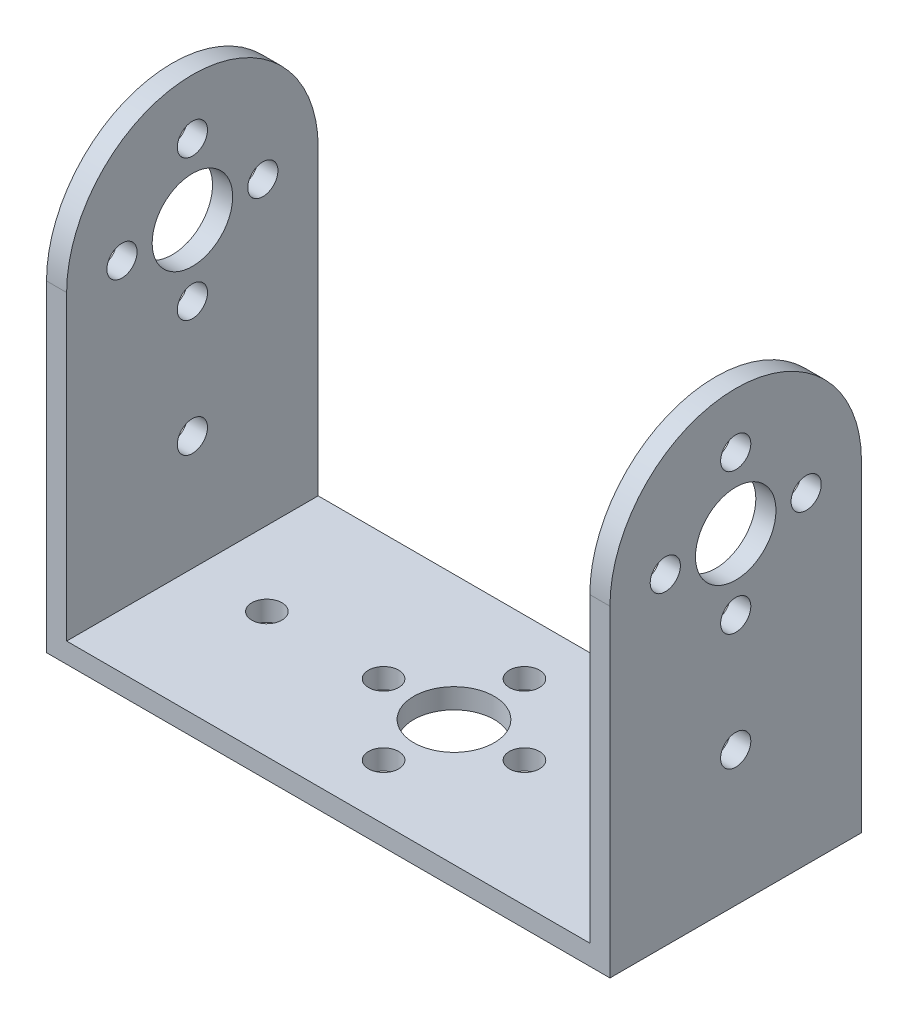
ISO-10303-21;
HEADER;
FILE_DESCRIPTION(('STEP AP214'),'2;1');
FILE_NAME('part.step','',(''),(''),'','','');
FILE_SCHEMA(('AUTOMOTIVE_DESIGN { 1 0 10303 214 1 1 1 1 }'));
ENDSEC;
DATA;
#1=APPLICATION_CONTEXT('core data for automotive mechanical design processes');
#2=APPLICATION_PROTOCOL_DEFINITION('international standard','automotive_design',2000,#1);
#3=PRODUCT_CONTEXT('',#1,'mechanical');
#4=PRODUCT('Part','Part','',(#3));
#5=PRODUCT_RELATED_PRODUCT_CATEGORY('part','',(#4));
#6=PRODUCT_DEFINITION_FORMATION('','',#4);
#7=PRODUCT_DEFINITION_CONTEXT('part definition',#1,'design');
#8=PRODUCT_DEFINITION('design','',#6,#7);
#9=PRODUCT_DEFINITION_SHAPE('','',#8);
#10=(LENGTH_UNIT() NAMED_UNIT(*) SI_UNIT(.MILLI.,.METRE.));
#11=(NAMED_UNIT(*) PLANE_ANGLE_UNIT() SI_UNIT($,.RADIAN.));
#12=(NAMED_UNIT(*) SI_UNIT($,.STERADIAN.) SOLID_ANGLE_UNIT());
#13=UNCERTAINTY_MEASURE_WITH_UNIT(LENGTH_MEASURE(1.E-05),#10,'distance_accuracy_value','');
#14=(GEOMETRIC_REPRESENTATION_CONTEXT(3) GLOBAL_UNCERTAINTY_ASSIGNED_CONTEXT((#13)) GLOBAL_UNIT_ASSIGNED_CONTEXT((#10,
#11,#12)) REPRESENTATION_CONTEXT('',''));
#15=CARTESIAN_POINT('',(0.,0.,0.));
#16=DIRECTION('',(0.,0.,1.));
#17=DIRECTION('',(1.,0.,0.));
#18=AXIS2_PLACEMENT_3D('',#15,#16,#17);
#19=CARTESIAN_POINT('',(0.,2.,0.));
#20=DIRECTION('',(0.,1.,0.));
#21=DIRECTION('',(0.,0.,1.));
#22=AXIS2_PLACEMENT_3D('',#19,#20,#21);
#23=PLANE('',#22);
#24=CARTESIAN_POINT('',(26.2542553191489,2.,-0.73138297872341));
#25=DIRECTION('',(0.,1.,0.));
#26=DIRECTION('',(0.,0.,1.));
#27=AXIS2_PLACEMENT_3D('',#24,#25,#26);
#28=CIRCLE('',#27,1.5);
#29=CARTESIAN_POINT('',(26.2542553191489,2.,0.768617021276591));
#30=VERTEX_POINT('',#29);
#31=EDGE_CURVE('E193',#30,#30,#28,.T.);
#32=ORIENTED_EDGE('',*,*,#31,.F.);
#33=EDGE_LOOP('',(#32));
#34=FACE_BOUND('',#33,.T.);
#35=CARTESIAN_POINT('',(0.654255319149036,2.,-0.731382978723379));
#36=DIRECTION('',(0.,1.,0.));
#37=DIRECTION('',(0.,0.,1.));
#38=AXIS2_PLACEMENT_3D('',#35,#36,#37);
#39=CIRCLE('',#38,1.5);
#40=CARTESIAN_POINT('',(0.654255319149036,2.,0.768617021276619));
#41=VERTEX_POINT('',#40);
#42=EDGE_CURVE('E206',#41,#41,#39,.T.);
#43=ORIENTED_EDGE('',*,*,#42,.F.);
#44=EDGE_LOOP('',(#43));
#45=FACE_BOUND('',#44,.T.);
#46=CARTESIAN_POINT('',(7.65425531914909,2.,6.2686170212766));
#47=DIRECTION('',(0.,1.,0.));
#48=DIRECTION('',(0.,0.,1.));
#49=AXIS2_PLACEMENT_3D('',#46,#47,#48);
#50=CIRCLE('',#49,1.5);
#51=CARTESIAN_POINT('',(7.65425531914909,2.,7.7686170212766));
#52=VERTEX_POINT('',#51);
#53=EDGE_CURVE('E200',#52,#52,#50,.T.);
#54=ORIENTED_EDGE('',*,*,#53,.F.);
#55=EDGE_LOOP('',(#54));
#56=FACE_BOUND('',#55,.T.);
#57=CARTESIAN_POINT('',(14.654255319149,2.,-0.731382978723479));
#58=DIRECTION('',(0.,1.,0.));
#59=DIRECTION('',(0.,0.,1.));
#60=AXIS2_PLACEMENT_3D('',#57,#58,#59);
#61=CIRCLE('',#60,1.5);
#62=CARTESIAN_POINT('',(14.654255319149,2.,0.768617021276519));
#63=VERTEX_POINT('',#62);
#64=EDGE_CURVE('E199',#63,#63,#61,.T.);
#65=ORIENTED_EDGE('',*,*,#64,.F.);
#66=EDGE_LOOP('',(#65));
#67=FACE_BOUND('',#66,.T.);
#68=CARTESIAN_POINT('',(-10.9457446808511,2.,-0.731382978723405));
#69=DIRECTION('',(0.,1.,0.));
#70=DIRECTION('',(0.,0.,1.));
#71=AXIS2_PLACEMENT_3D('',#68,#69,#70);
#72=CIRCLE('',#71,1.5);
#73=CARTESIAN_POINT('',(-10.9457446808511,2.,0.768617021276595));
#74=VERTEX_POINT('',#73);
#75=EDGE_CURVE('E224',#74,#74,#72,.T.);
#76=ORIENTED_EDGE('',*,*,#75,.F.);
#77=EDGE_LOOP('',(#76));
#78=FACE_BOUND('',#77,.T.);
#79=CARTESIAN_POINT('',(7.65425531914894,2.,-7.73138297872341));
#80=DIRECTION('',(0.,1.,0.));
#81=DIRECTION('',(0.,0.,1.));
#82=AXIS2_PLACEMENT_3D('',#79,#80,#81);
#83=CIRCLE('',#82,1.5);
#84=CARTESIAN_POINT('',(7.65425531914894,2.,-6.23138297872341));
#85=VERTEX_POINT('',#84);
#86=EDGE_CURVE('E218',#85,#85,#83,.T.);
#87=ORIENTED_EDGE('',*,*,#86,.F.);
#88=EDGE_LOOP('',(#87));
#89=FACE_BOUND('',#88,.T.);
#90=CARTESIAN_POINT('',(7.65425531914894,2.,-0.731382978723405));
#91=DIRECTION('',(0.,1.,0.));
#92=DIRECTION('',(0.,0.,1.));
#93=AXIS2_PLACEMENT_3D('',#90,#91,#92);
#94=CIRCLE('',#93,4.);
#95=CARTESIAN_POINT('',(7.65425531914894,2.,3.2686170212766));
#96=VERTEX_POINT('',#95);
#97=EDGE_CURVE('E217',#96,#96,#94,.T.);
#98=ORIENTED_EDGE('',*,*,#97,.F.);
#99=EDGE_LOOP('',(#98));
#100=FACE_BOUND('',#99,.T.);
#101=DIRECTION('',(1.,0.,0.));
#102=VECTOR('',#101,1.);
#103=CARTESIAN_POINT('',(-20.3457446808511,2.,11.7686170212766));
#104=LINE('',#103,#102);
#105=CARTESIAN_POINT('',(-18.3457446808511,2.,11.7686170212766));
#106=VERTEX_POINT('',#105);
#107=CARTESIAN_POINT('',(33.6542553191489,2.,11.7686170212766));
#108=VERTEX_POINT('',#107);
#109=EDGE_CURVE('E54',#106,#108,#104,.T.);
#110=ORIENTED_EDGE('',*,*,#109,.T.);
#111=DIRECTION('',(0.,0.,1.));
#112=VECTOR('',#111,1.);
#113=CARTESIAN_POINT('',(33.6542553191489,2.,-13.2313829787234));
#114=LINE('',#113,#112);
#115=CARTESIAN_POINT('',(33.6542553191489,2.,-13.2313829787234));
#116=VERTEX_POINT('',#115);
#117=EDGE_CURVE('E127',#116,#108,#114,.T.);
#118=ORIENTED_EDGE('',*,*,#117,.F.);
#119=DIRECTION('',(-1.,0.,0.));
#120=VECTOR('',#119,1.);
#121=CARTESIAN_POINT('',(-20.3457446808511,2.,-13.2313829787234));
#122=LINE('',#121,#120);
#123=CARTESIAN_POINT('',(-18.3457446808511,2.,-13.2313829787234));
#124=VERTEX_POINT('',#123);
#125=EDGE_CURVE('E131',#116,#124,#122,.T.);
#126=ORIENTED_EDGE('',*,*,#125,.T.);
#127=DIRECTION('',(0.,0.,1.));
#128=VECTOR('',#127,1.);
#129=CARTESIAN_POINT('',(-18.3457446808511,2.,-13.2313829787234));
#130=LINE('',#129,#128);
#131=EDGE_CURVE('E181',#124,#106,#130,.T.);
#132=ORIENTED_EDGE('',*,*,#131,.T.);
#133=EDGE_LOOP('',(#110,#118,#126,#132));
#134=FACE_BOUND('',#133,.T.);
#135=ADVANCED_FACE('F39',(#34,#45,#56,#67,#78,#89,#100,#134),#23,.T.);
#136=CARTESIAN_POINT('',(-20.3457446808511,2.,-13.2313829787234));
#137=DIRECTION('',(1.,0.,0.));
#138=DIRECTION('',(0.,0.,-1.));
#139=AXIS2_PLACEMENT_3D('',#136,#137,#138);
#140=PLANE('',#139);
#141=CARTESIAN_POINT('',(-20.3457446808511,32.,-7.73138297872331));
#142=DIRECTION('',(-1.,0.,0.));
#143=DIRECTION('',(0.,0.,1.));
#144=AXIS2_PLACEMENT_3D('',#141,#142,#143);
#145=CIRCLE('',#144,1.5);
#146=CARTESIAN_POINT('',(-20.3457446808511,32.,-6.23138297872331));
#147=VERTEX_POINT('',#146);
#148=EDGE_CURVE('E141',#147,#147,#145,.T.);
#149=ORIENTED_EDGE('',*,*,#148,.F.);
#150=EDGE_LOOP('',(#149));
#151=FACE_BOUND('',#150,.T.);
#152=CARTESIAN_POINT('',(-20.3457446808511,25.,-0.731382978723258));
#153=DIRECTION('',(-1.,0.,0.));
#154=DIRECTION('',(0.,0.,1.));
#155=AXIS2_PLACEMENT_3D('',#152,#153,#154);
#156=CIRCLE('',#155,1.5);
#157=CARTESIAN_POINT('',(-20.3457446808511,25.,0.768617021276742));
#158=VERTEX_POINT('',#157);
#159=EDGE_CURVE('E151',#158,#158,#156,.T.);
#160=ORIENTED_EDGE('',*,*,#159,.F.);
#161=EDGE_LOOP('',(#160));
#162=FACE_BOUND('',#161,.T.);
#163=CARTESIAN_POINT('',(-20.3457446808511,32.0000000000001,6.26861702127669));
#164=DIRECTION('',(-1.,0.,0.));
#165=DIRECTION('',(0.,0.,1.));
#166=AXIS2_PLACEMENT_3D('',#163,#164,#165);
#167=CIRCLE('',#166,1.5);
#168=CARTESIAN_POINT('',(-20.3457446808511,32.0000000000001,7.76861702127669));
#169=VERTEX_POINT('',#168);
#170=EDGE_CURVE('E143',#169,#169,#167,.T.);
#171=ORIENTED_EDGE('',*,*,#170,.F.);
#172=EDGE_LOOP('',(#171));
#173=FACE_BOUND('',#172,.T.);
#174=CARTESIAN_POINT('',(-20.3457446808511,39.,-0.731382978723405));
#175=DIRECTION('',(-1.,0.,0.));
#176=DIRECTION('',(0.,0.,1.));
#177=AXIS2_PLACEMENT_3D('',#174,#175,#176);
#178=CIRCLE('',#177,1.5);
#179=CARTESIAN_POINT('',(-20.3457446808511,39.,0.768617021276596));
#180=VERTEX_POINT('',#179);
#181=EDGE_CURVE('E150',#180,#180,#178,.T.);
#182=ORIENTED_EDGE('',*,*,#181,.F.);
#183=EDGE_LOOP('',(#182));
#184=FACE_BOUND('',#183,.T.);
#185=CARTESIAN_POINT('',(-20.3457446808511,32.,-0.731382978723405));
#186=DIRECTION('',(-1.,0.,0.));
#187=DIRECTION('',(0.,0.,1.));
#188=AXIS2_PLACEMENT_3D('',#185,#186,#187);
#189=CIRCLE('',#188,4.);
#190=CARTESIAN_POINT('',(-20.3457446808511,32.,3.2686170212766));
#191=VERTEX_POINT('',#190);
#192=EDGE_CURVE('E161',#191,#191,#189,.T.);
#193=ORIENTED_EDGE('',*,*,#192,.F.);
#194=EDGE_LOOP('',(#193));
#195=FACE_BOUND('',#194,.T.);
#196=CARTESIAN_POINT('',(-20.3457446808511,13.4,-0.731382978723405));
#197=DIRECTION('',(-1.,0.,0.));
#198=DIRECTION('',(0.,0.,1.));
#199=AXIS2_PLACEMENT_3D('',#196,#197,#198);
#200=CIRCLE('',#199,1.5);
#201=CARTESIAN_POINT('',(-20.3457446808511,13.4,0.768617021276595));
#202=VERTEX_POINT('',#201);
#203=EDGE_CURVE('E168',#202,#202,#200,.T.);
#204=ORIENTED_EDGE('',*,*,#203,.F.);
#205=EDGE_LOOP('',(#204));
#206=FACE_BOUND('',#205,.T.);
#207=DIRECTION('',(0.,0.,1.));
#208=VECTOR('',#207,1.);
#209=CARTESIAN_POINT('',(-20.3457446808511,0.,-13.2313829787234));
#210=LINE('',#209,#208);
#211=CARTESIAN_POINT('',(-20.3457446808511,0.,-13.2313829787234));
#212=VERTEX_POINT('',#211);
#213=CARTESIAN_POINT('',(-20.3457446808511,0.,11.7686170212766));
#214=VERTEX_POINT('',#213);
#215=EDGE_CURVE('E235',#212,#214,#210,.T.);
#216=ORIENTED_EDGE('',*,*,#215,.T.);
#217=DIRECTION('',(0.,-1.,0.));
#218=VECTOR('',#217,1.);
#219=CARTESIAN_POINT('',(-20.3457446808511,2.,11.7686170212766));
#220=LINE('',#219,#218);
#221=CARTESIAN_POINT('',(-20.3457446808511,32.,11.7686170212766));
#222=VERTEX_POINT('',#221);
#223=EDGE_CURVE('E11',#222,#214,#220,.T.);
#224=ORIENTED_EDGE('',*,*,#223,.F.);
#225=CARTESIAN_POINT('',(-20.3457446808511,32.,-0.731382978723405));
#226=DIRECTION('',(-1.,0.,0.));
#227=DIRECTION('',(0.,0.,1.));
#228=AXIS2_PLACEMENT_3D('',#225,#226,#227);
#229=CIRCLE('',#228,12.5);
#230=CARTESIAN_POINT('',(-20.3457446808511,32.,-13.2313829787234));
#231=VERTEX_POINT('',#230);
#232=EDGE_CURVE('E178',#222,#231,#229,.T.);
#233=ORIENTED_EDGE('',*,*,#232,.T.);
#234=DIRECTION('',(0.,-1.,0.));
#235=VECTOR('',#234,1.);
#236=CARTESIAN_POINT('',(-20.3457446808511,2.,-13.2313829787234));
#237=LINE('',#236,#235);
#238=EDGE_CURVE('E241',#231,#212,#237,.T.);
#239=ORIENTED_EDGE('',*,*,#238,.T.);
#240=EDGE_LOOP('',(#216,#224,#233,#239));
#241=FACE_BOUND('',#240,.T.);
#242=ADVANCED_FACE('F41',(#151,#162,#173,#184,#195,#206,#241),#140,.F.);
#243=CARTESIAN_POINT('',(-20.3457446808511,2.,11.7686170212766));
#244=DIRECTION('',(0.,0.,-1.));
#245=DIRECTION('',(-1.,0.,0.));
#246=AXIS2_PLACEMENT_3D('',#243,#244,#245);
#247=PLANE('',#246);
#248=DIRECTION('',(1.,0.,0.));
#249=VECTOR('',#248,1.);
#250=CARTESIAN_POINT('',(-20.3457446808511,0.,11.7686170212766));
#251=LINE('',#250,#249);
#252=CARTESIAN_POINT('',(35.6542553191489,0.,11.7686170212766));
#253=VERTEX_POINT('',#252);
#254=EDGE_CURVE('E244',#214,#253,#251,.T.);
#255=ORIENTED_EDGE('',*,*,#254,.T.);
#256=DIRECTION('',(0.,-1.,0.));
#257=VECTOR('',#256,1.);
#258=CARTESIAN_POINT('',(35.6542553191489,2.,11.7686170212766));
#259=LINE('',#258,#257);
#260=CARTESIAN_POINT('',(35.6542553191489,32.,11.7686170212766));
#261=VERTEX_POINT('',#260);
#262=EDGE_CURVE('E47',#261,#253,#259,.T.);
#263=ORIENTED_EDGE('',*,*,#262,.F.);
#264=DIRECTION('',(1.,0.,0.));
#265=VECTOR('',#264,1.);
#266=CARTESIAN_POINT('',(33.6542553191489,32.,11.7686170212766));
#267=LINE('',#266,#265);
#268=CARTESIAN_POINT('',(33.6542553191489,32.,11.7686170212766));
#269=VERTEX_POINT('',#268);
#270=EDGE_CURVE('E126',#269,#261,#267,.T.);
#271=ORIENTED_EDGE('',*,*,#270,.F.);
#272=DIRECTION('',(0.,1.,0.));
#273=VECTOR('',#272,1.);
#274=CARTESIAN_POINT('',(33.6542553191489,2.,11.7686170212766));
#275=LINE('',#274,#273);
#276=EDGE_CURVE('E113',#108,#269,#275,.T.);
#277=ORIENTED_EDGE('',*,*,#276,.F.);
#278=ORIENTED_EDGE('',*,*,#109,.F.);
#279=DIRECTION('',(0.,1.,0.));
#280=VECTOR('',#279,1.);
#281=CARTESIAN_POINT('',(-18.3457446808511,2.,11.7686170212766));
#282=LINE('',#281,#280);
#283=CARTESIAN_POINT('',(-18.3457446808511,32.,11.7686170212766));
#284=VERTEX_POINT('',#283);
#285=EDGE_CURVE('E62',#106,#284,#282,.T.);
#286=ORIENTED_EDGE('',*,*,#285,.T.);
#287=DIRECTION('',(-1.,0.,0.));
#288=VECTOR('',#287,1.);
#289=CARTESIAN_POINT('',(-18.3457446808511,32.,11.7686170212766));
#290=LINE('',#289,#288);
#291=EDGE_CURVE('E187',#284,#222,#290,.T.);
#292=ORIENTED_EDGE('',*,*,#291,.T.);
#293=ORIENTED_EDGE('',*,*,#223,.T.);
#294=EDGE_LOOP('',(#255,#263,#271,#277,#278,#286,#292,#293));
#295=FACE_BOUND('',#294,.T.);
#296=ADVANCED_FACE('F267',(#295),#247,.F.);
#297=CARTESIAN_POINT('',(35.6542553191489,2.,-13.2313829787234));
#298=DIRECTION('',(-1.,0.,0.));
#299=DIRECTION('',(0.,0.,1.));
#300=AXIS2_PLACEMENT_3D('',#297,#298,#299);
#301=PLANE('',#300);
#302=CARTESIAN_POINT('',(35.6542553191489,32.,-7.73138297872331));
#303=DIRECTION('',(-1.,0.,0.));
#304=DIRECTION('',(0.,0.,1.));
#305=AXIS2_PLACEMENT_3D('',#302,#303,#304);
#306=CIRCLE('',#305,1.5);
#307=CARTESIAN_POINT('',(35.6542553191489,32.,-6.23138297872331));
#308=VERTEX_POINT('',#307);
#309=EDGE_CURVE('E565',#308,#308,#306,.T.);
#310=ORIENTED_EDGE('',*,*,#309,.T.);
#311=EDGE_LOOP('',(#310));
#312=FACE_BOUND('',#311,.T.);
#313=CARTESIAN_POINT('',(35.6542553191489,25.,-0.731382978723258));
#314=DIRECTION('',(-1.,0.,0.));
#315=DIRECTION('',(0.,0.,1.));
#316=AXIS2_PLACEMENT_3D('',#313,#314,#315);
#317=CIRCLE('',#316,1.5);
#318=CARTESIAN_POINT('',(35.6542553191489,25.,0.768617021276742));
#319=VERTEX_POINT('',#318);
#320=EDGE_CURVE('E601',#319,#319,#317,.T.);
#321=ORIENTED_EDGE('',*,*,#320,.T.);
#322=EDGE_LOOP('',(#321));
#323=FACE_BOUND('',#322,.T.);
#324=CARTESIAN_POINT('',(35.6542553191489,32.0000000000001,6.26861702127669));
#325=DIRECTION('',(-1.,0.,0.));
#326=DIRECTION('',(0.,0.,1.));
#327=AXIS2_PLACEMENT_3D('',#324,#325,#326);
#328=CIRCLE('',#327,1.5);
#329=CARTESIAN_POINT('',(35.6542553191489,32.0000000000001,7.76861702127669));
#330=VERTEX_POINT('',#329);
#331=EDGE_CURVE('E585',#330,#330,#328,.T.);
#332=ORIENTED_EDGE('',*,*,#331,.T.);
#333=EDGE_LOOP('',(#332));
#334=FACE_BOUND('',#333,.T.);
#335=CARTESIAN_POINT('',(35.6542553191489,39.,-0.731382978723405));
#336=DIRECTION('',(-1.,0.,0.));
#337=DIRECTION('',(0.,0.,1.));
#338=AXIS2_PLACEMENT_3D('',#335,#336,#337);
#339=CIRCLE('',#338,1.5);
#340=CARTESIAN_POINT('',(35.6542553191489,39.,0.768617021276596));
#341=VERTEX_POINT('',#340);
#342=EDGE_CURVE('E580',#341,#341,#339,.T.);
#343=ORIENTED_EDGE('',*,*,#342,.T.);
#344=EDGE_LOOP('',(#343));
#345=FACE_BOUND('',#344,.T.);
#346=CARTESIAN_POINT('',(35.6542553191489,32.,-0.731382978723405));
#347=DIRECTION('',(-1.,0.,0.));
#348=DIRECTION('',(0.,0.,1.));
#349=AXIS2_PLACEMENT_3D('',#346,#347,#348);
#350=CIRCLE('',#349,4.);
#351=CARTESIAN_POINT('',(35.6542553191489,32.,3.2686170212766));
#352=VERTEX_POINT('',#351);
#353=EDGE_CURVE('E574',#352,#352,#350,.T.);
#354=ORIENTED_EDGE('',*,*,#353,.T.);
#355=EDGE_LOOP('',(#354));
#356=FACE_BOUND('',#355,.T.);
#357=CARTESIAN_POINT('',(35.6542553191489,13.4,-0.731382978723405));
#358=DIRECTION('',(-1.,0.,0.));
#359=DIRECTION('',(0.,0.,1.));
#360=AXIS2_PLACEMENT_3D('',#357,#358,#359);
#361=CIRCLE('',#360,1.5);
#362=CARTESIAN_POINT('',(35.6542553191489,13.4,0.768617021276595));
#363=VERTEX_POINT('',#362);
#364=EDGE_CURVE('E133',#363,#363,#361,.T.);
#365=ORIENTED_EDGE('',*,*,#364,.T.);
#366=EDGE_LOOP('',(#365));
#367=FACE_BOUND('',#366,.T.);
#368=DIRECTION('',(0.,0.,-1.));
#369=VECTOR('',#368,1.);
#370=CARTESIAN_POINT('',(35.6542553191489,0.,-13.2313829787234));
#371=LINE('',#370,#369);
#372=CARTESIAN_POINT('',(35.6542553191489,0.,-13.2313829787234));
#373=VERTEX_POINT('',#372);
#374=EDGE_CURVE('E246',#253,#373,#371,.T.);
#375=ORIENTED_EDGE('',*,*,#374,.T.);
#376=DIRECTION('',(0.,-1.,0.));
#377=VECTOR('',#376,1.);
#378=CARTESIAN_POINT('',(35.6542553191489,2.,-13.2313829787234));
#379=LINE('',#378,#377);
#380=CARTESIAN_POINT('',(35.6542553191489,32.,-13.2313829787234));
#381=VERTEX_POINT('',#380);
#382=EDGE_CURVE('E251',#381,#373,#379,.T.);
#383=ORIENTED_EDGE('',*,*,#382,.F.);
#384=CARTESIAN_POINT('',(35.6542553191489,32.,-0.731382978723405));
#385=DIRECTION('',(-1.,0.,0.));
#386=DIRECTION('',(0.,0.,1.));
#387=AXIS2_PLACEMENT_3D('',#384,#385,#386);
#388=CIRCLE('',#387,12.5);
#389=EDGE_CURVE('E123',#261,#381,#388,.T.);
#390=ORIENTED_EDGE('',*,*,#389,.F.);
#391=ORIENTED_EDGE('',*,*,#262,.T.);
#392=EDGE_LOOP('',(#375,#383,#390,#391));
#393=FACE_BOUND('',#392,.T.);
#394=ADVANCED_FACE('F255',(#312,#323,#334,#345,#356,#367,#393),#301,.F.);
#395=CARTESIAN_POINT('',(-20.3457446808511,2.,-13.2313829787234));
#396=DIRECTION('',(0.,0.,1.));
#397=DIRECTION('',(1.,0.,0.));
#398=AXIS2_PLACEMENT_3D('',#395,#396,#397);
#399=PLANE('',#398);
#400=DIRECTION('',(-1.,0.,0.));
#401=VECTOR('',#400,1.);
#402=CARTESIAN_POINT('',(-20.3457446808511,0.,-13.2313829787234));
#403=LINE('',#402,#401);
#404=EDGE_CURVE('E239',#373,#212,#403,.T.);
#405=ORIENTED_EDGE('',*,*,#404,.T.);
#406=ORIENTED_EDGE('',*,*,#238,.F.);
#407=DIRECTION('',(-1.,0.,0.));
#408=VECTOR('',#407,1.);
#409=CARTESIAN_POINT('',(-18.3457446808511,32.,-13.2313829787234));
#410=LINE('',#409,#408);
#411=CARTESIAN_POINT('',(-18.3457446808511,32.,-13.2313829787234));
#412=VERTEX_POINT('',#411);
#413=EDGE_CURVE('E190',#412,#231,#410,.T.);
#414=ORIENTED_EDGE('',*,*,#413,.F.);
#415=DIRECTION('',(0.,-1.,0.));
#416=VECTOR('',#415,1.);
#417=CARTESIAN_POINT('',(-18.3457446808511,2.,-13.2313829787234));
#418=LINE('',#417,#416);
#419=EDGE_CURVE('E179',#412,#124,#418,.T.);
#420=ORIENTED_EDGE('',*,*,#419,.T.);
#421=ORIENTED_EDGE('',*,*,#125,.F.);
#422=DIRECTION('',(0.,-1.,0.));
#423=VECTOR('',#422,1.);
#424=CARTESIAN_POINT('',(33.6542553191489,2.,-13.2313829787234));
#425=LINE('',#424,#423);
#426=CARTESIAN_POINT('',(33.6542553191489,32.,-13.2313829787234));
#427=VERTEX_POINT('',#426);
#428=EDGE_CURVE('E111',#427,#116,#425,.T.);
#429=ORIENTED_EDGE('',*,*,#428,.F.);
#430=DIRECTION('',(1.,0.,0.));
#431=VECTOR('',#430,1.);
#432=CARTESIAN_POINT('',(33.6542553191489,32.,-13.2313829787234));
#433=LINE('',#432,#431);
#434=EDGE_CURVE('E120',#427,#381,#433,.T.);
#435=ORIENTED_EDGE('',*,*,#434,.T.);
#436=ORIENTED_EDGE('',*,*,#382,.T.);
#437=EDGE_LOOP('',(#405,#406,#414,#420,#421,#429,#435,#436));
#438=FACE_BOUND('',#437,.T.);
#439=ADVANCED_FACE('F129',(#438),#399,.F.);
#440=CARTESIAN_POINT('',(0.,0.,0.));
#441=DIRECTION('',(0.,1.,0.));
#442=DIRECTION('',(0.,0.,1.));
#443=AXIS2_PLACEMENT_3D('',#440,#441,#442);
#444=PLANE('',#443);
#445=CARTESIAN_POINT('',(26.2542553191489,0.,-0.73138297872341));
#446=DIRECTION('',(0.,1.,0.));
#447=DIRECTION('',(0.,0.,1.));
#448=AXIS2_PLACEMENT_3D('',#445,#446,#447);
#449=CIRCLE('',#448,1.5);
#450=CARTESIAN_POINT('',(26.2542553191489,0.,0.768617021276591));
#451=VERTEX_POINT('',#450);
#452=EDGE_CURVE('E209',#451,#451,#449,.T.);
#453=ORIENTED_EDGE('',*,*,#452,.T.);
#454=EDGE_LOOP('',(#453));
#455=FACE_BOUND('',#454,.T.);
#456=CARTESIAN_POINT('',(0.654255319149036,0.,-0.731382978723379));
#457=DIRECTION('',(0.,1.,0.));
#458=DIRECTION('',(0.,0.,1.));
#459=AXIS2_PLACEMENT_3D('',#456,#457,#458);
#460=CIRCLE('',#459,1.5);
#461=CARTESIAN_POINT('',(0.654255319149036,0.,0.768617021276619));
#462=VERTEX_POINT('',#461);
#463=EDGE_CURVE('E203',#462,#462,#460,.T.);
#464=ORIENTED_EDGE('',*,*,#463,.T.);
#465=EDGE_LOOP('',(#464));
#466=FACE_BOUND('',#465,.T.);
#467=CARTESIAN_POINT('',(7.65425531914909,0.,6.2686170212766));
#468=DIRECTION('',(0.,1.,0.));
#469=DIRECTION('',(0.,0.,1.));
#470=AXIS2_PLACEMENT_3D('',#467,#468,#469);
#471=CIRCLE('',#470,1.5);
#472=CARTESIAN_POINT('',(7.65425531914909,0.,7.7686170212766));
#473=VERTEX_POINT('',#472);
#474=EDGE_CURVE('E196',#473,#473,#471,.T.);
#475=ORIENTED_EDGE('',*,*,#474,.T.);
#476=EDGE_LOOP('',(#475));
#477=FACE_BOUND('',#476,.T.);
#478=CARTESIAN_POINT('',(14.654255319149,0.,-0.731382978723479));
#479=DIRECTION('',(0.,1.,0.));
#480=DIRECTION('',(0.,0.,1.));
#481=AXIS2_PLACEMENT_3D('',#478,#479,#480);
#482=CIRCLE('',#481,1.5);
#483=CARTESIAN_POINT('',(14.654255319149,0.,0.768617021276519));
#484=VERTEX_POINT('',#483);
#485=EDGE_CURVE('E227',#484,#484,#482,.T.);
#486=ORIENTED_EDGE('',*,*,#485,.T.);
#487=EDGE_LOOP('',(#486));
#488=FACE_BOUND('',#487,.T.);
#489=CARTESIAN_POINT('',(-10.9457446808511,0.,-0.731382978723405));
#490=DIRECTION('',(0.,1.,0.));
#491=DIRECTION('',(0.,0.,1.));
#492=AXIS2_PLACEMENT_3D('',#489,#490,#491);
#493=CIRCLE('',#492,1.5);
#494=CARTESIAN_POINT('',(-10.9457446808511,0.,0.768617021276595));
#495=VERTEX_POINT('',#494);
#496=EDGE_CURVE('E221',#495,#495,#493,.T.);
#497=ORIENTED_EDGE('',*,*,#496,.T.);
#498=EDGE_LOOP('',(#497));
#499=FACE_BOUND('',#498,.T.);
#500=CARTESIAN_POINT('',(7.65425531914894,0.,-7.73138297872341));
#501=DIRECTION('',(0.,1.,0.));
#502=DIRECTION('',(0.,0.,1.));
#503=AXIS2_PLACEMENT_3D('',#500,#501,#502);
#504=CIRCLE('',#503,1.5);
#505=CARTESIAN_POINT('',(7.65425531914894,0.,-6.23138297872341));
#506=VERTEX_POINT('',#505);
#507=EDGE_CURVE('E214',#506,#506,#504,.T.);
#508=ORIENTED_EDGE('',*,*,#507,.T.);
#509=EDGE_LOOP('',(#508));
#510=FACE_BOUND('',#509,.T.);
#511=CARTESIAN_POINT('',(7.65425531914894,0.,-0.731382978723405));
#512=DIRECTION('',(0.,1.,0.));
#513=DIRECTION('',(0.,0.,1.));
#514=AXIS2_PLACEMENT_3D('',#511,#512,#513);
#515=CIRCLE('',#514,4.);
#516=CARTESIAN_POINT('',(7.65425531914894,0.,3.2686170212766));
#517=VERTEX_POINT('',#516);
#518=EDGE_CURVE('E232',#517,#517,#515,.T.);
#519=ORIENTED_EDGE('',*,*,#518,.T.);
#520=EDGE_LOOP('',(#519));
#521=FACE_BOUND('',#520,.T.);
#522=ORIENTED_EDGE('',*,*,#215,.F.);
#523=ORIENTED_EDGE('',*,*,#404,.F.);
#524=ORIENTED_EDGE('',*,*,#374,.F.);
#525=ORIENTED_EDGE('',*,*,#254,.F.);
#526=EDGE_LOOP('',(#522,#523,#524,#525));
#527=FACE_BOUND('',#526,.T.);
#528=ADVANCED_FACE('F260',(#455,#466,#477,#488,#499,#510,#521,#527),#444,.F.);
#529=CARTESIAN_POINT('',(7.65425531914894,0.,-0.731382978723405));
#530=DIRECTION('',(0.,1.,0.));
#531=DIRECTION('',(0.,0.,1.));
#532=AXIS2_PLACEMENT_3D('',#529,#530,#531);
#533=CYLINDRICAL_SURFACE('',#532,4.);
#534=ORIENTED_EDGE('',*,*,#518,.F.);
#535=EDGE_LOOP('',(#534));
#536=FACE_BOUND('',#535,.T.);
#537=ORIENTED_EDGE('',*,*,#97,.T.);
#538=EDGE_LOOP('',(#537));
#539=FACE_BOUND('',#538,.T.);
#540=ADVANCED_FACE('F285',(#536,#539),#533,.F.);
#541=CARTESIAN_POINT('',(7.65425531914894,0.,-7.73138297872341));
#542=DIRECTION('',(0.,1.,0.));
#543=DIRECTION('',(0.,0.,1.));
#544=AXIS2_PLACEMENT_3D('',#541,#542,#543);
#545=CYLINDRICAL_SURFACE('',#544,1.5);
#546=ORIENTED_EDGE('',*,*,#507,.F.);
#547=EDGE_LOOP('',(#546));
#548=FACE_BOUND('',#547,.T.);
#549=ORIENTED_EDGE('',*,*,#86,.T.);
#550=EDGE_LOOP('',(#549));
#551=FACE_BOUND('',#550,.T.);
#552=ADVANCED_FACE('F306',(#548,#551),#545,.F.);
#553=CARTESIAN_POINT('',(-10.9457446808511,0.,-0.731382978723405));
#554=DIRECTION('',(0.,1.,0.));
#555=DIRECTION('',(0.,0.,1.));
#556=AXIS2_PLACEMENT_3D('',#553,#554,#555);
#557=CYLINDRICAL_SURFACE('',#556,1.5);
#558=ORIENTED_EDGE('',*,*,#496,.F.);
#559=EDGE_LOOP('',(#558));
#560=FACE_BOUND('',#559,.T.);
#561=ORIENTED_EDGE('',*,*,#75,.T.);
#562=EDGE_LOOP('',(#561));
#563=FACE_BOUND('',#562,.T.);
#564=ADVANCED_FACE('F313',(#560,#563),#557,.F.);
#565=CARTESIAN_POINT('',(14.654255319149,0.,-0.731382978723479));
#566=DIRECTION('',(0.,1.,0.));
#567=DIRECTION('',(0.,0.,1.));
#568=AXIS2_PLACEMENT_3D('',#565,#566,#567);
#569=CYLINDRICAL_SURFACE('',#568,1.5);
#570=ORIENTED_EDGE('',*,*,#485,.F.);
#571=EDGE_LOOP('',(#570));
#572=FACE_BOUND('',#571,.T.);
#573=ORIENTED_EDGE('',*,*,#64,.T.);
#574=EDGE_LOOP('',(#573));
#575=FACE_BOUND('',#574,.T.);
#576=ADVANCED_FACE('F321',(#572,#575),#569,.F.);
#577=CARTESIAN_POINT('',(7.65425531914909,0.,6.2686170212766));
#578=DIRECTION('',(0.,1.,0.));
#579=DIRECTION('',(0.,0.,1.));
#580=AXIS2_PLACEMENT_3D('',#577,#578,#579);
#581=CYLINDRICAL_SURFACE('',#580,1.5);
#582=ORIENTED_EDGE('',*,*,#474,.F.);
#583=EDGE_LOOP('',(#582));
#584=FACE_BOUND('',#583,.T.);
#585=ORIENTED_EDGE('',*,*,#53,.T.);
#586=EDGE_LOOP('',(#585));
#587=FACE_BOUND('',#586,.T.);
#588=ADVANCED_FACE('F329',(#584,#587),#581,.F.);
#589=CARTESIAN_POINT('',(0.654255319149036,0.,-0.731382978723379));
#590=DIRECTION('',(0.,1.,0.));
#591=DIRECTION('',(0.,0.,1.));
#592=AXIS2_PLACEMENT_3D('',#589,#590,#591);
#593=CYLINDRICAL_SURFACE('',#592,1.5);
#594=ORIENTED_EDGE('',*,*,#463,.F.);
#595=EDGE_LOOP('',(#594));
#596=FACE_BOUND('',#595,.T.);
#597=ORIENTED_EDGE('',*,*,#42,.T.);
#598=EDGE_LOOP('',(#597));
#599=FACE_BOUND('',#598,.T.);
#600=ADVANCED_FACE('F336',(#596,#599),#593,.F.);
#601=CARTESIAN_POINT('',(26.2542553191489,0.,-0.73138297872341));
#602=DIRECTION('',(0.,1.,0.));
#603=DIRECTION('',(0.,0.,1.));
#604=AXIS2_PLACEMENT_3D('',#601,#602,#603);
#605=CYLINDRICAL_SURFACE('',#604,1.5);
#606=ORIENTED_EDGE('',*,*,#452,.F.);
#607=EDGE_LOOP('',(#606));
#608=FACE_BOUND('',#607,.T.);
#609=ORIENTED_EDGE('',*,*,#31,.T.);
#610=EDGE_LOOP('',(#609));
#611=FACE_BOUND('',#610,.T.);
#612=ADVANCED_FACE('F344',(#608,#611),#605,.F.);
#613=CARTESIAN_POINT('',(-18.3457446808511,32.,-0.731382978723405));
#614=DIRECTION('',(-1.,0.,0.));
#615=DIRECTION('',(0.,0.,1.));
#616=AXIS2_PLACEMENT_3D('',#613,#614,#615);
#617=CYLINDRICAL_SURFACE('',#616,12.5);
#618=ORIENTED_EDGE('',*,*,#232,.F.);
#619=ORIENTED_EDGE('',*,*,#291,.F.);
#620=CARTESIAN_POINT('',(-18.3457446808511,32.,-0.731382978723405));
#621=DIRECTION('',(-1.,0.,0.));
#622=DIRECTION('',(0.,0.,1.));
#623=AXIS2_PLACEMENT_3D('',#620,#621,#622);
#624=CIRCLE('',#623,12.5);
#625=EDGE_CURVE('E184',#284,#412,#624,.T.);
#626=ORIENTED_EDGE('',*,*,#625,.T.);
#627=ORIENTED_EDGE('',*,*,#413,.T.);
#628=EDGE_LOOP('',(#618,#619,#626,#627));
#629=FACE_BOUND('',#628,.T.);
#630=ADVANCED_FACE('F264',(#629),#617,.T.);
#631=CARTESIAN_POINT('',(-18.3457446808511,32.,-0.731382978723405));
#632=DIRECTION('',(-1.,0.,0.));
#633=DIRECTION('',(0.,0.,1.));
#634=AXIS2_PLACEMENT_3D('',#631,#632,#633);
#635=PLANE('',#634);
#636=CARTESIAN_POINT('',(-18.3457446808511,32.,-7.73138297872331));
#637=DIRECTION('',(-1.,0.,0.));
#638=DIRECTION('',(0.,0.,1.));
#639=AXIS2_PLACEMENT_3D('',#636,#637,#638);
#640=CIRCLE('',#639,1.5);
#641=CARTESIAN_POINT('',(-18.3457446808511,32.,-6.23138297872331));
#642=VERTEX_POINT('',#641);
#643=EDGE_CURVE('E154',#642,#642,#640,.F.);
#644=ORIENTED_EDGE('',*,*,#643,.F.);
#645=EDGE_LOOP('',(#644));
#646=FACE_BOUND('',#645,.T.);
#647=CARTESIAN_POINT('',(-18.3457446808511,25.,-0.731382978723258));
#648=DIRECTION('',(-1.,0.,0.));
#649=DIRECTION('',(0.,0.,1.));
#650=AXIS2_PLACEMENT_3D('',#647,#648,#649);
#651=CIRCLE('',#650,1.5);
#652=CARTESIAN_POINT('',(-18.3457446808511,25.,0.768617021276742));
#653=VERTEX_POINT('',#652);
#654=EDGE_CURVE('E147',#653,#653,#651,.F.);
#655=ORIENTED_EDGE('',*,*,#654,.F.);
#656=EDGE_LOOP('',(#655));
#657=FACE_BOUND('',#656,.T.);
#658=CARTESIAN_POINT('',(-18.3457446808511,32.0000000000001,6.26861702127669));
#659=DIRECTION('',(-1.,0.,0.));
#660=DIRECTION('',(0.,0.,1.));
#661=AXIS2_PLACEMENT_3D('',#658,#659,#660);
#662=CIRCLE('',#661,1.5);
#663=CARTESIAN_POINT('',(-18.3457446808511,32.0000000000001,7.76861702127669));
#664=VERTEX_POINT('',#663);
#665=EDGE_CURVE('E146',#664,#664,#662,.F.);
#666=ORIENTED_EDGE('',*,*,#665,.F.);
#667=EDGE_LOOP('',(#666));
#668=FACE_BOUND('',#667,.T.);
#669=CARTESIAN_POINT('',(-18.3457446808511,39.,-0.731382978723405));
#670=DIRECTION('',(-1.,0.,0.));
#671=DIRECTION('',(0.,0.,1.));
#672=AXIS2_PLACEMENT_3D('',#669,#670,#671);
#673=CIRCLE('',#672,1.5);
#674=CARTESIAN_POINT('',(-18.3457446808511,39.,0.768617021276596));
#675=VERTEX_POINT('',#674);
#676=EDGE_CURVE('E165',#675,#675,#673,.F.);
#677=ORIENTED_EDGE('',*,*,#676,.F.);
#678=EDGE_LOOP('',(#677));
#679=FACE_BOUND('',#678,.T.);
#680=CARTESIAN_POINT('',(-18.3457446808511,32.,-0.731382978723405));
#681=DIRECTION('',(-1.,0.,0.));
#682=DIRECTION('',(0.,0.,1.));
#683=AXIS2_PLACEMENT_3D('',#680,#681,#682);
#684=CIRCLE('',#683,4.);
#685=CARTESIAN_POINT('',(-18.3457446808511,32.,3.2686170212766));
#686=VERTEX_POINT('',#685);
#687=EDGE_CURVE('E164',#686,#686,#684,.F.);
#688=ORIENTED_EDGE('',*,*,#687,.F.);
#689=EDGE_LOOP('',(#688));
#690=FACE_BOUND('',#689,.T.);
#691=CARTESIAN_POINT('',(-18.3457446808511,13.4,-0.731382978723405));
#692=DIRECTION('',(-1.,0.,0.));
#693=DIRECTION('',(0.,0.,1.));
#694=AXIS2_PLACEMENT_3D('',#691,#692,#693);
#695=CIRCLE('',#694,1.5);
#696=CARTESIAN_POINT('',(-18.3457446808511,13.4,0.768617021276595));
#697=VERTEX_POINT('',#696);
#698=EDGE_CURVE('E175',#697,#697,#695,.F.);
#699=ORIENTED_EDGE('',*,*,#698,.F.);
#700=EDGE_LOOP('',(#699));
#701=FACE_BOUND('',#700,.T.);
#702=ORIENTED_EDGE('',*,*,#419,.F.);
#703=ORIENTED_EDGE('',*,*,#625,.F.);
#704=ORIENTED_EDGE('',*,*,#285,.F.);
#705=ORIENTED_EDGE('',*,*,#131,.F.);
#706=EDGE_LOOP('',(#702,#703,#704,#705));
#707=FACE_BOUND('',#706,.T.);
#708=ADVANCED_FACE('F266',(#646,#657,#668,#679,#690,#701,#707),#635,.F.);
#709=CARTESIAN_POINT('',(35.6552553191489,13.4,-0.731382978723405));
#710=DIRECTION('',(-1.,0.,0.));
#711=DIRECTION('',(0.,0.,1.));
#712=AXIS2_PLACEMENT_3D('',#709,#710,#711);
#713=CYLINDRICAL_SURFACE('',#712,1.5);
#714=ORIENTED_EDGE('',*,*,#203,.T.);
#715=EDGE_LOOP('',(#714));
#716=FACE_BOUND('',#715,.T.);
#717=ORIENTED_EDGE('',*,*,#698,.T.);
#718=EDGE_LOOP('',(#717));
#719=FACE_BOUND('',#718,.T.);
#720=ADVANCED_FACE('F366',(#716,#719),#713,.F.);
#721=CARTESIAN_POINT('',(35.6552553191489,32.,-0.731382978723405));
#722=DIRECTION('',(-1.,0.,0.));
#723=DIRECTION('',(0.,0.,1.));
#724=AXIS2_PLACEMENT_3D('',#721,#722,#723);
#725=CYLINDRICAL_SURFACE('',#724,4.);
#726=ORIENTED_EDGE('',*,*,#192,.T.);
#727=EDGE_LOOP('',(#726));
#728=FACE_BOUND('',#727,.T.);
#729=ORIENTED_EDGE('',*,*,#687,.T.);
#730=EDGE_LOOP('',(#729));
#731=FACE_BOUND('',#730,.T.);
#732=ADVANCED_FACE('F374',(#728,#731),#725,.F.);
#733=CARTESIAN_POINT('',(35.6552553191489,39.,-0.731382978723405));
#734=DIRECTION('',(-1.,0.,0.));
#735=DIRECTION('',(0.,0.,1.));
#736=AXIS2_PLACEMENT_3D('',#733,#734,#735);
#737=CYLINDRICAL_SURFACE('',#736,1.5);
#738=ORIENTED_EDGE('',*,*,#181,.T.);
#739=EDGE_LOOP('',(#738));
#740=FACE_BOUND('',#739,.T.);
#741=ORIENTED_EDGE('',*,*,#676,.T.);
#742=EDGE_LOOP('',(#741));
#743=FACE_BOUND('',#742,.T.);
#744=ADVANCED_FACE('F382',(#740,#743),#737,.F.);
#745=CARTESIAN_POINT('',(35.6552553191489,32.0000000000001,6.26861702127669));
#746=DIRECTION('',(-1.,0.,0.));
#747=DIRECTION('',(0.,0.,1.));
#748=AXIS2_PLACEMENT_3D('',#745,#746,#747);
#749=CYLINDRICAL_SURFACE('',#748,1.5);
#750=ORIENTED_EDGE('',*,*,#170,.T.);
#751=EDGE_LOOP('',(#750));
#752=FACE_BOUND('',#751,.T.);
#753=ORIENTED_EDGE('',*,*,#665,.T.);
#754=EDGE_LOOP('',(#753));
#755=FACE_BOUND('',#754,.T.);
#756=ADVANCED_FACE('F390',(#752,#755),#749,.F.);
#757=CARTESIAN_POINT('',(35.6552553191489,25.,-0.731382978723258));
#758=DIRECTION('',(-1.,0.,0.));
#759=DIRECTION('',(0.,0.,1.));
#760=AXIS2_PLACEMENT_3D('',#757,#758,#759);
#761=CYLINDRICAL_SURFACE('',#760,1.5);
#762=ORIENTED_EDGE('',*,*,#159,.T.);
#763=EDGE_LOOP('',(#762));
#764=FACE_BOUND('',#763,.T.);
#765=ORIENTED_EDGE('',*,*,#654,.T.);
#766=EDGE_LOOP('',(#765));
#767=FACE_BOUND('',#766,.T.);
#768=ADVANCED_FACE('F398',(#764,#767),#761,.F.);
#769=CARTESIAN_POINT('',(35.6552553191489,32.,-7.73138297872331));
#770=DIRECTION('',(-1.,0.,0.));
#771=DIRECTION('',(0.,0.,1.));
#772=AXIS2_PLACEMENT_3D('',#769,#770,#771);
#773=CYLINDRICAL_SURFACE('',#772,1.5);
#774=ORIENTED_EDGE('',*,*,#148,.T.);
#775=EDGE_LOOP('',(#774));
#776=FACE_BOUND('',#775,.T.);
#777=ORIENTED_EDGE('',*,*,#643,.T.);
#778=EDGE_LOOP('',(#777));
#779=FACE_BOUND('',#778,.T.);
#780=ADVANCED_FACE('F406',(#776,#779),#773,.F.);
#781=CARTESIAN_POINT('',(33.6542553191489,32.,-0.731382978723405));
#782=DIRECTION('',(1.,0.,0.));
#783=DIRECTION('',(0.,0.,-1.));
#784=AXIS2_PLACEMENT_3D('',#781,#782,#783);
#785=CYLINDRICAL_SURFACE('',#784,12.5);
#786=ORIENTED_EDGE('',*,*,#389,.T.);
#787=ORIENTED_EDGE('',*,*,#434,.F.);
#788=CARTESIAN_POINT('',(33.6542553191489,32.,-0.731382978723405));
#789=DIRECTION('',(-1.,0.,0.));
#790=DIRECTION('',(0.,0.,1.));
#791=AXIS2_PLACEMENT_3D('',#788,#789,#790);
#792=CIRCLE('',#791,12.5);
#793=EDGE_CURVE('E107',#269,#427,#792,.T.);
#794=ORIENTED_EDGE('',*,*,#793,.F.);
#795=ORIENTED_EDGE('',*,*,#270,.T.);
#796=EDGE_LOOP('',(#786,#787,#794,#795));
#797=FACE_BOUND('',#796,.T.);
#798=ADVANCED_FACE('F121',(#797),#785,.T.);
#799=CARTESIAN_POINT('',(33.6542553191489,32.,-0.731382978723405));
#800=DIRECTION('',(1.,0.,0.));
#801=DIRECTION('',(0.,0.,1.));
#802=AXIS2_PLACEMENT_3D('',#799,#800,#801);
#803=PLANE('',#802);
#804=CARTESIAN_POINT('',(33.6542553191489,32.,-7.73138297872331));
#805=DIRECTION('',(1.,0.,0.));
#806=DIRECTION('',(0.,0.,-1.));
#807=AXIS2_PLACEMENT_3D('',#804,#805,#806);
#808=CIRCLE('',#807,1.5);
#809=CARTESIAN_POINT('',(33.6542553191489,32.,-9.23138297872331));
#810=VERTEX_POINT('',#809);
#811=EDGE_CURVE('E568',#810,#810,#808,.T.);
#812=ORIENTED_EDGE('',*,*,#811,.T.);
#813=EDGE_LOOP('',(#812));
#814=FACE_BOUND('',#813,.T.);
#815=CARTESIAN_POINT('',(33.6542553191489,25.,-0.731382978723258));
#816=DIRECTION('',(1.,0.,0.));
#817=DIRECTION('',(0.,0.,-1.));
#818=AXIS2_PLACEMENT_3D('',#815,#816,#817);
#819=CIRCLE('',#818,1.5);
#820=CARTESIAN_POINT('',(33.6542553191489,25.,-2.23138297872326));
#821=VERTEX_POINT('',#820);
#822=EDGE_CURVE('E570',#821,#821,#819,.T.);
#823=ORIENTED_EDGE('',*,*,#822,.T.);
#824=EDGE_LOOP('',(#823));
#825=FACE_BOUND('',#824,.T.);
#826=CARTESIAN_POINT('',(33.6542553191489,32.0000000000001,6.26861702127669));
#827=DIRECTION('',(1.,0.,0.));
#828=DIRECTION('',(0.,0.,-1.));
#829=AXIS2_PLACEMENT_3D('',#826,#827,#828);
#830=CIRCLE('',#829,1.5);
#831=CARTESIAN_POINT('',(33.6542553191489,32.0000000000001,4.76861702127668));
#832=VERTEX_POINT('',#831);
#833=EDGE_CURVE('E596',#832,#832,#830,.T.);
#834=ORIENTED_EDGE('',*,*,#833,.T.);
#835=EDGE_LOOP('',(#834));
#836=FACE_BOUND('',#835,.T.);
#837=CARTESIAN_POINT('',(33.6542553191489,39.,-0.731382978723405));
#838=DIRECTION('',(1.,0.,0.));
#839=DIRECTION('',(0.,0.,-1.));
#840=AXIS2_PLACEMENT_3D('',#837,#838,#839);
#841=CIRCLE('',#840,1.5);
#842=CARTESIAN_POINT('',(33.6542553191489,39.,-2.23138297872341));
#843=VERTEX_POINT('',#842);
#844=EDGE_CURVE('E583',#843,#843,#841,.T.);
#845=ORIENTED_EDGE('',*,*,#844,.T.);
#846=EDGE_LOOP('',(#845));
#847=FACE_BOUND('',#846,.T.);
#848=CARTESIAN_POINT('',(33.6542553191489,32.,-0.731382978723405));
#849=DIRECTION('',(1.,0.,0.));
#850=DIRECTION('',(0.,0.,-1.));
#851=AXIS2_PLACEMENT_3D('',#848,#849,#850);
#852=CIRCLE('',#851,4.);
#853=CARTESIAN_POINT('',(33.6542553191489,32.,-4.73138297872341));
#854=VERTEX_POINT('',#853);
#855=EDGE_CURVE('E577',#854,#854,#852,.T.);
#856=ORIENTED_EDGE('',*,*,#855,.T.);
#857=EDGE_LOOP('',(#856));
#858=FACE_BOUND('',#857,.T.);
#859=CARTESIAN_POINT('',(33.6542553191489,13.4,-0.731382978723405));
#860=DIRECTION('',(1.,0.,0.));
#861=DIRECTION('',(0.,0.,-1.));
#862=AXIS2_PLACEMENT_3D('',#859,#860,#861);
#863=CIRCLE('',#862,1.5);
#864=CARTESIAN_POINT('',(33.6542553191489,13.4,-2.23138297872341));
#865=VERTEX_POINT('',#864);
#866=EDGE_CURVE('E136',#865,#865,#863,.T.);
#867=ORIENTED_EDGE('',*,*,#866,.T.);
#868=EDGE_LOOP('',(#867));
#869=FACE_BOUND('',#868,.T.);
#870=ORIENTED_EDGE('',*,*,#428,.T.);
#871=ORIENTED_EDGE('',*,*,#117,.T.);
#872=ORIENTED_EDGE('',*,*,#276,.T.);
#873=ORIENTED_EDGE('',*,*,#793,.T.);
#874=EDGE_LOOP('',(#870,#871,#872,#873));
#875=FACE_BOUND('',#874,.T.);
#876=ADVANCED_FACE('F109',(#814,#825,#836,#847,#858,#869,#875),#803,.F.);
#877=CARTESIAN_POINT('',(-20.3467446808511,13.4,-0.731382978723405));
#878=DIRECTION('',(1.,0.,0.));
#879=DIRECTION('',(0.,0.,-1.));
#880=AXIS2_PLACEMENT_3D('',#877,#878,#879);
#881=CYLINDRICAL_SURFACE('',#880,1.5);
#882=ORIENTED_EDGE('',*,*,#364,.F.);
#883=EDGE_LOOP('',(#882));
#884=FACE_BOUND('',#883,.T.);
#885=ORIENTED_EDGE('',*,*,#866,.F.);
#886=EDGE_LOOP('',(#885));
#887=FACE_BOUND('',#886,.T.);
#888=ADVANCED_FACE('F426',(#884,#887),#881,.F.);
#889=CARTESIAN_POINT('',(-20.3467446808511,32.,-0.731382978723405));
#890=DIRECTION('',(1.,0.,0.));
#891=DIRECTION('',(0.,0.,-1.));
#892=AXIS2_PLACEMENT_3D('',#889,#890,#891);
#893=CYLINDRICAL_SURFACE('',#892,4.);
#894=ORIENTED_EDGE('',*,*,#353,.F.);
#895=EDGE_LOOP('',(#894));
#896=FACE_BOUND('',#895,.T.);
#897=ORIENTED_EDGE('',*,*,#855,.F.);
#898=EDGE_LOOP('',(#897));
#899=FACE_BOUND('',#898,.T.);
#900=ADVANCED_FACE('F434',(#896,#899),#893,.F.);
#901=CARTESIAN_POINT('',(-20.3467446808511,39.,-0.731382978723405));
#902=DIRECTION('',(1.,0.,0.));
#903=DIRECTION('',(0.,0.,-1.));
#904=AXIS2_PLACEMENT_3D('',#901,#902,#903);
#905=CYLINDRICAL_SURFACE('',#904,1.5);
#906=ORIENTED_EDGE('',*,*,#342,.F.);
#907=EDGE_LOOP('',(#906));
#908=FACE_BOUND('',#907,.T.);
#909=ORIENTED_EDGE('',*,*,#844,.F.);
#910=EDGE_LOOP('',(#909));
#911=FACE_BOUND('',#910,.T.);
#912=ADVANCED_FACE('F442',(#908,#911),#905,.F.);
#913=CARTESIAN_POINT('',(-20.3467446808511,32.0000000000001,6.26861702127669));
#914=DIRECTION('',(1.,0.,0.));
#915=DIRECTION('',(0.,0.,-1.));
#916=AXIS2_PLACEMENT_3D('',#913,#914,#915);
#917=CYLINDRICAL_SURFACE('',#916,1.5);
#918=ORIENTED_EDGE('',*,*,#331,.F.);
#919=EDGE_LOOP('',(#918));
#920=FACE_BOUND('',#919,.T.);
#921=ORIENTED_EDGE('',*,*,#833,.F.);
#922=EDGE_LOOP('',(#921));
#923=FACE_BOUND('',#922,.T.);
#924=ADVANCED_FACE('F450',(#920,#923),#917,.F.);
#925=CARTESIAN_POINT('',(-20.3467446808511,25.,-0.731382978723258));
#926=DIRECTION('',(1.,0.,0.));
#927=DIRECTION('',(0.,0.,-1.));
#928=AXIS2_PLACEMENT_3D('',#925,#926,#927);
#929=CYLINDRICAL_SURFACE('',#928,1.5);
#930=ORIENTED_EDGE('',*,*,#320,.F.);
#931=EDGE_LOOP('',(#930));
#932=FACE_BOUND('',#931,.T.);
#933=ORIENTED_EDGE('',*,*,#822,.F.);
#934=EDGE_LOOP('',(#933));
#935=FACE_BOUND('',#934,.T.);
#936=ADVANCED_FACE('F458',(#932,#935),#929,.F.);
#937=CARTESIAN_POINT('',(-20.3467446808511,32.,-7.73138297872331));
#938=DIRECTION('',(1.,0.,0.));
#939=DIRECTION('',(0.,0.,-1.));
#940=AXIS2_PLACEMENT_3D('',#937,#938,#939);
#941=CYLINDRICAL_SURFACE('',#940,1.5);
#942=ORIENTED_EDGE('',*,*,#309,.F.);
#943=EDGE_LOOP('',(#942));
#944=FACE_BOUND('',#943,.T.);
#945=ORIENTED_EDGE('',*,*,#811,.F.);
#946=EDGE_LOOP('',(#945));
#947=FACE_BOUND('',#946,.T.);
#948=ADVANCED_FACE('F466',(#944,#947),#941,.F.);
#949=CLOSED_SHELL('',(#135,#242,#296,#394,#439,#528,#540,#552,#564,#576,#588,#600,#612,#630,
#708,#720,#732,#744,#756,#768,#780,#798,#876,#888,#900,#912,#924,#936,#948));
#950=MANIFOLD_SOLID_BREP('B2',#949);
#951=ADVANCED_BREP_SHAPE_REPRESENTATION('',(#18,#950),#14);
#952=SHAPE_DEFINITION_REPRESENTATION(#9,#951);
ENDSEC;
END-ISO-10303-21;
